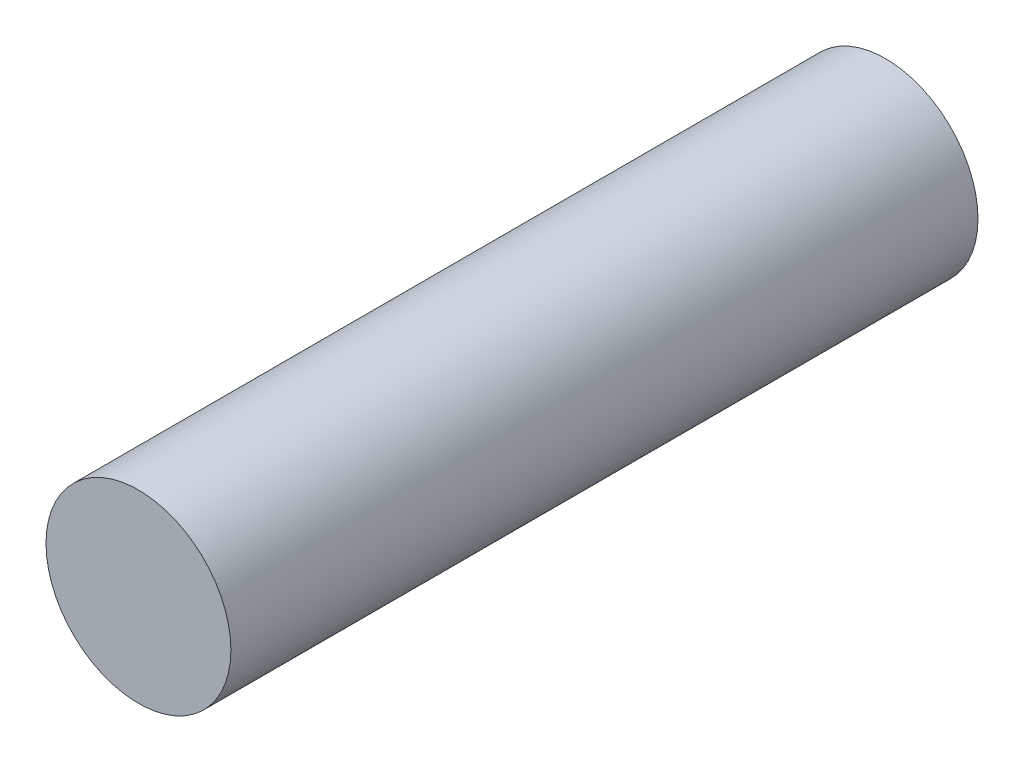
ISO-10303-21;
HEADER;
FILE_DESCRIPTION(('STEP AP214'),'2;1');
FILE_NAME('part.step','',(''),(''),'','','');
FILE_SCHEMA(('AUTOMOTIVE_DESIGN { 1 0 10303 214 1 1 1 1 }'));
ENDSEC;
DATA;
#1=APPLICATION_CONTEXT('core data for automotive mechanical design processes');
#2=APPLICATION_PROTOCOL_DEFINITION('international standard','automotive_design',2000,#1);
#3=PRODUCT_CONTEXT('',#1,'mechanical');
#4=PRODUCT('Part','Part','',(#3));
#5=PRODUCT_RELATED_PRODUCT_CATEGORY('part','',(#4));
#6=PRODUCT_DEFINITION_FORMATION('','',#4);
#7=PRODUCT_DEFINITION_CONTEXT('part definition',#1,'design');
#8=PRODUCT_DEFINITION('design','',#6,#7);
#9=PRODUCT_DEFINITION_SHAPE('','',#8);
#10=(LENGTH_UNIT() NAMED_UNIT(*) SI_UNIT(.MILLI.,.METRE.));
#11=(NAMED_UNIT(*) PLANE_ANGLE_UNIT() SI_UNIT($,.RADIAN.));
#12=(NAMED_UNIT(*) SI_UNIT($,.STERADIAN.) SOLID_ANGLE_UNIT());
#13=UNCERTAINTY_MEASURE_WITH_UNIT(LENGTH_MEASURE(1.E-05),#10,'distance_accuracy_value','');
#14=(GEOMETRIC_REPRESENTATION_CONTEXT(3) GLOBAL_UNCERTAINTY_ASSIGNED_CONTEXT((#13)) GLOBAL_UNIT_ASSIGNED_CONTEXT((#10,
#11,#12)) REPRESENTATION_CONTEXT('',''));
#15=CARTESIAN_POINT('',(0.,0.,0.));
#16=DIRECTION('',(0.,0.,1.));
#17=DIRECTION('',(1.,0.,0.));
#18=AXIS2_PLACEMENT_3D('',#15,#16,#17);
#19=CARTESIAN_POINT('',(1.91414545977653,-1.56897168834141,20.));
#20=DIRECTION('',(0.,0.,-1.));
#21=DIRECTION('',(-1.,0.,0.));
#22=AXIS2_PLACEMENT_3D('',#19,#20,#21);
#23=CYLINDRICAL_SURFACE('',#22,2.475);
#24=CARTESIAN_POINT('',(1.91414545977653,-1.56897168834141,20.));
#25=DIRECTION('',(0.,0.,1.));
#26=DIRECTION('',(1.,0.,0.));
#27=AXIS2_PLACEMENT_3D('',#24,#25,#26);
#28=CIRCLE('',#27,2.475);
#29=CARTESIAN_POINT('',(4.38914545977653,-1.56897168834141,20.));
#30=VERTEX_POINT('',#29);
#31=EDGE_CURVE('E10',#30,#30,#28,.T.);
#32=ORIENTED_EDGE('',*,*,#31,.F.);
#33=EDGE_LOOP('',(#32));
#34=FACE_BOUND('',#33,.T.);
#35=CARTESIAN_POINT('',(1.91414545977653,-1.56897168834141,0.));
#36=DIRECTION('',(0.,0.,1.));
#37=DIRECTION('',(1.,0.,0.));
#38=AXIS2_PLACEMENT_3D('',#35,#36,#37);
#39=CIRCLE('',#38,2.475);
#40=CARTESIAN_POINT('',(4.38914545977653,-1.56897168834141,0.));
#41=VERTEX_POINT('',#40);
#42=EDGE_CURVE('E40',#41,#41,#39,.T.);
#43=ORIENTED_EDGE('',*,*,#42,.T.);
#44=EDGE_LOOP('',(#43));
#45=FACE_BOUND('',#44,.T.);
#46=ADVANCED_FACE('F37',(#34,#45),#23,.T.);
#47=CARTESIAN_POINT('',(1.91414545977653,-1.56897168834141,20.));
#48=DIRECTION('',(0.,0.,1.));
#49=DIRECTION('',(1.,0.,0.));
#50=AXIS2_PLACEMENT_3D('',#47,#48,#49);
#51=PLANE('',#50);
#52=ORIENTED_EDGE('',*,*,#31,.T.);
#53=EDGE_LOOP('',(#52));
#54=FACE_BOUND('',#53,.T.);
#55=ADVANCED_FACE('F52',(#54),#51,.T.);
#56=CARTESIAN_POINT('',(1.91414545977653,-1.56897168834141,0.));
#57=DIRECTION('',(0.,0.,1.));
#58=DIRECTION('',(1.,0.,0.));
#59=AXIS2_PLACEMENT_3D('',#56,#57,#58);
#60=PLANE('',#59);
#61=ORIENTED_EDGE('',*,*,#42,.F.);
#62=EDGE_LOOP('',(#61));
#63=FACE_BOUND('',#62,.T.);
#64=ADVANCED_FACE('F50',(#63),#60,.F.);
#65=CLOSED_SHELL('',(#46,#55,#64));
#66=MANIFOLD_SOLID_BREP('B2',#65);
#67=ADVANCED_BREP_SHAPE_REPRESENTATION('',(#18,#66),#14);
#68=SHAPE_DEFINITION_REPRESENTATION(#9,#67);
ENDSEC;
END-ISO-10303-21;
